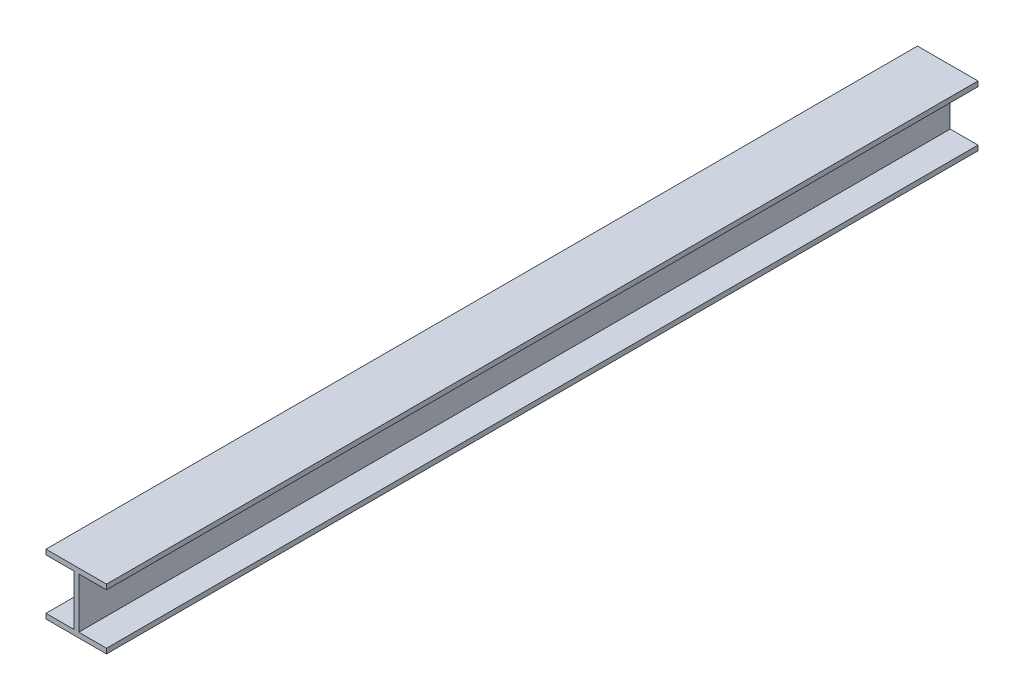
ISO-10303-21;
HEADER;
FILE_DESCRIPTION(('STEP AP214'),'2;1');
FILE_NAME('part.step','',(''),(''),'','','');
FILE_SCHEMA(('AUTOMOTIVE_DESIGN { 1 0 10303 214 1 1 1 1 }'));
ENDSEC;
DATA;
#1=APPLICATION_CONTEXT('core data for automotive mechanical design processes');
#2=APPLICATION_PROTOCOL_DEFINITION('international standard','automotive_design',2000,#1);
#3=PRODUCT_CONTEXT('',#1,'mechanical');
#4=PRODUCT('Part','Part','',(#3));
#5=PRODUCT_RELATED_PRODUCT_CATEGORY('part','',(#4));
#6=PRODUCT_DEFINITION_FORMATION('','',#4);
#7=PRODUCT_DEFINITION_CONTEXT('part definition',#1,'design');
#8=PRODUCT_DEFINITION('design','',#6,#7);
#9=PRODUCT_DEFINITION_SHAPE('','',#8);
#10=(LENGTH_UNIT() NAMED_UNIT(*) SI_UNIT(.MILLI.,.METRE.));
#11=(NAMED_UNIT(*) PLANE_ANGLE_UNIT() SI_UNIT($,.RADIAN.));
#12=(NAMED_UNIT(*) SI_UNIT($,.STERADIAN.) SOLID_ANGLE_UNIT());
#13=UNCERTAINTY_MEASURE_WITH_UNIT(LENGTH_MEASURE(1.E-05),#10,'distance_accuracy_value','');
#14=(GEOMETRIC_REPRESENTATION_CONTEXT(3) GLOBAL_UNCERTAINTY_ASSIGNED_CONTEXT((#13)) GLOBAL_UNIT_ASSIGNED_CONTEXT((#10,
#11,#12)) REPRESENTATION_CONTEXT('',''));
#15=CARTESIAN_POINT('',(0.,0.,0.));
#16=DIRECTION('',(0.,0.,1.));
#17=DIRECTION('',(1.,0.,0.));
#18=AXIS2_PLACEMENT_3D('',#15,#16,#17);
#19=CARTESIAN_POINT('',(63.5,63.5,914.4));
#20=DIRECTION('',(-1.,0.,0.));
#21=DIRECTION('',(0.,-1.,0.));
#22=AXIS2_PLACEMENT_3D('',#19,#20,#21);
#23=PLANE('',#22);
#24=DIRECTION('',(0.,1.,0.));
#25=VECTOR('',#24,1.);
#26=CARTESIAN_POINT('',(63.5,63.5,-914.4));
#27=LINE('',#26,#25);
#28=CARTESIAN_POINT('',(63.5,53.0352,-914.4));
#29=VERTEX_POINT('',#28);
#30=CARTESIAN_POINT('',(63.5,63.5,-914.4));
#31=VERTEX_POINT('',#30);
#32=EDGE_CURVE('E156',#29,#31,#27,.T.);
#33=ORIENTED_EDGE('',*,*,#32,.T.);
#34=DIRECTION('',(0.,0.,-1.));
#35=VECTOR('',#34,1.);
#36=CARTESIAN_POINT('',(63.5,63.5,914.4));
#37=LINE('',#36,#35);
#38=CARTESIAN_POINT('',(63.5,63.5,914.4));
#39=VERTEX_POINT('',#38);
#40=EDGE_CURVE('E11',#39,#31,#37,.T.);
#41=ORIENTED_EDGE('',*,*,#40,.F.);
#42=DIRECTION('',(0.,1.,0.));
#43=VECTOR('',#42,1.);
#44=CARTESIAN_POINT('',(63.5,63.5,914.4));
#45=LINE('',#44,#43);
#46=CARTESIAN_POINT('',(63.5,53.0352,914.4));
#47=VERTEX_POINT('',#46);
#48=EDGE_CURVE('E178',#47,#39,#45,.T.);
#49=ORIENTED_EDGE('',*,*,#48,.F.);
#50=DIRECTION('',(0.,0.,-1.));
#51=VECTOR('',#50,1.);
#52=CARTESIAN_POINT('',(63.5,53.0352,914.4));
#53=LINE('',#52,#51);
#54=EDGE_CURVE('E152',#47,#29,#53,.T.);
#55=ORIENTED_EDGE('',*,*,#54,.T.);
#56=EDGE_LOOP('',(#33,#41,#49,#55));
#57=FACE_BOUND('',#56,.T.);
#58=ADVANCED_FACE('F36',(#57),#23,.F.);
#59=CARTESIAN_POINT('',(-63.5,63.5,914.4));
#60=DIRECTION('',(0.,-1.,0.));
#61=DIRECTION('',(1.,0.,0.));
#62=AXIS2_PLACEMENT_3D('',#59,#60,#61);
#63=PLANE('',#62);
#64=DIRECTION('',(-1.,0.,0.));
#65=VECTOR('',#64,1.);
#66=CARTESIAN_POINT('',(-63.5,63.5,-914.4));
#67=LINE('',#66,#65);
#68=CARTESIAN_POINT('',(-63.5,63.5,-914.4));
#69=VERTEX_POINT('',#68);
#70=EDGE_CURVE('E159',#31,#69,#67,.T.);
#71=ORIENTED_EDGE('',*,*,#70,.T.);
#72=DIRECTION('',(0.,0.,-1.));
#73=VECTOR('',#72,1.);
#74=CARTESIAN_POINT('',(-63.5,63.5,914.4));
#75=LINE('',#74,#73);
#76=CARTESIAN_POINT('',(-63.5,63.5,914.4));
#77=VERTEX_POINT('',#76);
#78=EDGE_CURVE('E44',#77,#69,#75,.T.);
#79=ORIENTED_EDGE('',*,*,#78,.F.);
#80=DIRECTION('',(-1.,0.,0.));
#81=VECTOR('',#80,1.);
#82=CARTESIAN_POINT('',(-63.5,63.5,914.4));
#83=LINE('',#82,#81);
#84=EDGE_CURVE('E107',#39,#77,#83,.T.);
#85=ORIENTED_EDGE('',*,*,#84,.F.);
#86=ORIENTED_EDGE('',*,*,#40,.T.);
#87=EDGE_LOOP('',(#71,#79,#85,#86));
#88=FACE_BOUND('',#87,.T.);
#89=ADVANCED_FACE('F256',(#88),#63,.F.);
#90=CARTESIAN_POINT('',(-63.5,63.5,914.4));
#91=DIRECTION('',(1.,0.,0.));
#92=DIRECTION('',(0.,1.,0.));
#93=AXIS2_PLACEMENT_3D('',#90,#91,#92);
#94=PLANE('',#93);
#95=DIRECTION('',(0.,-1.,0.));
#96=VECTOR('',#95,1.);
#97=CARTESIAN_POINT('',(-63.5,63.5,-914.4));
#98=LINE('',#97,#96);
#99=CARTESIAN_POINT('',(-63.5,53.0352,-914.4));
#100=VERTEX_POINT('',#99);
#101=EDGE_CURVE('E161',#69,#100,#98,.T.);
#102=ORIENTED_EDGE('',*,*,#101,.T.);
#103=DIRECTION('',(0.,0.,-1.));
#104=VECTOR('',#103,1.);
#105=CARTESIAN_POINT('',(-63.5,53.0352,914.4));
#106=LINE('',#105,#104);
#107=CARTESIAN_POINT('',(-63.5,53.0352,914.4));
#108=VERTEX_POINT('',#107);
#109=EDGE_CURVE('E197',#108,#100,#106,.T.);
#110=ORIENTED_EDGE('',*,*,#109,.F.);
#111=DIRECTION('',(0.,-1.,0.));
#112=VECTOR('',#111,1.);
#113=CARTESIAN_POINT('',(-63.5,63.5,914.4));
#114=LINE('',#113,#112);
#115=EDGE_CURVE('E205',#77,#108,#114,.T.);
#116=ORIENTED_EDGE('',*,*,#115,.F.);
#117=ORIENTED_EDGE('',*,*,#78,.T.);
#118=EDGE_LOOP('',(#102,#110,#116,#117));
#119=FACE_BOUND('',#118,.T.);
#120=ADVANCED_FACE('F203',(#119),#94,.F.);
#121=CARTESIAN_POINT('',(-63.5,53.0352,914.4));
#122=DIRECTION('',(0.,1.,0.));
#123=DIRECTION('',(-1.,0.,0.));
#124=AXIS2_PLACEMENT_3D('',#121,#122,#123);
#125=PLANE('',#124);
#126=DIRECTION('',(1.,0.,0.));
#127=VECTOR('',#126,1.);
#128=CARTESIAN_POINT('',(-63.5,53.0352,-914.4));
#129=LINE('',#128,#127);
#130=CARTESIAN_POINT('',(-5.24510000000002,53.0352,-914.4));
#131=VERTEX_POINT('',#130);
#132=EDGE_CURVE('E163',#100,#131,#129,.T.);
#133=ORIENTED_EDGE('',*,*,#132,.T.);
#134=DIRECTION('',(0.,0.,-1.));
#135=VECTOR('',#134,1.);
#136=CARTESIAN_POINT('',(-5.24510000000002,53.0352,914.4));
#137=LINE('',#136,#135);
#138=CARTESIAN_POINT('',(-5.24510000000002,53.0352,914.4));
#139=VERTEX_POINT('',#138);
#140=EDGE_CURVE('E194',#139,#131,#137,.T.);
#141=ORIENTED_EDGE('',*,*,#140,.F.);
#142=DIRECTION('',(1.,0.,0.));
#143=VECTOR('',#142,1.);
#144=CARTESIAN_POINT('',(-63.5,53.0352,914.4));
#145=LINE('',#144,#143);
#146=EDGE_CURVE('E223',#108,#139,#145,.T.);
#147=ORIENTED_EDGE('',*,*,#146,.F.);
#148=ORIENTED_EDGE('',*,*,#109,.T.);
#149=EDGE_LOOP('',(#133,#141,#147,#148));
#150=FACE_BOUND('',#149,.T.);
#151=ADVANCED_FACE('F214',(#150),#125,.F.);
#152=CARTESIAN_POINT('',(-5.24510000000002,53.0352,914.4));
#153=DIRECTION('',(1.,0.,0.));
#154=DIRECTION('',(0.,1.,0.));
#155=AXIS2_PLACEMENT_3D('',#152,#153,#154);
#156=PLANE('',#155);
#157=DIRECTION('',(0.,-1.,0.));
#158=VECTOR('',#157,1.);
#159=CARTESIAN_POINT('',(-5.24510000000002,53.0352,-914.4));
#160=LINE('',#159,#158);
#161=CARTESIAN_POINT('',(-5.2451,-53.0352,-914.4));
#162=VERTEX_POINT('',#161);
#163=EDGE_CURVE('E165',#131,#162,#160,.T.);
#164=ORIENTED_EDGE('',*,*,#163,.T.);
#165=DIRECTION('',(0.,0.,-1.));
#166=VECTOR('',#165,1.);
#167=CARTESIAN_POINT('',(-5.2451,-53.0352,914.4));
#168=LINE('',#167,#166);
#169=CARTESIAN_POINT('',(-5.2451,-53.0352,914.4));
#170=VERTEX_POINT('',#169);
#171=EDGE_CURVE('E191',#170,#162,#168,.T.);
#172=ORIENTED_EDGE('',*,*,#171,.F.);
#173=DIRECTION('',(0.,-1.,0.));
#174=VECTOR('',#173,1.);
#175=CARTESIAN_POINT('',(-5.24510000000002,53.0352,914.4));
#176=LINE('',#175,#174);
#177=EDGE_CURVE('E220',#139,#170,#176,.T.);
#178=ORIENTED_EDGE('',*,*,#177,.F.);
#179=ORIENTED_EDGE('',*,*,#140,.T.);
#180=EDGE_LOOP('',(#164,#172,#178,#179));
#181=FACE_BOUND('',#180,.T.);
#182=ADVANCED_FACE('F218',(#181),#156,.F.);
#183=CARTESIAN_POINT('',(-5.2451,-53.0352,914.4));
#184=DIRECTION('',(0.,-1.,0.));
#185=DIRECTION('',(1.,0.,0.));
#186=AXIS2_PLACEMENT_3D('',#183,#184,#185);
#187=PLANE('',#186);
#188=DIRECTION('',(-1.,0.,0.));
#189=VECTOR('',#188,1.);
#190=CARTESIAN_POINT('',(-5.2451,-53.0352,-914.4));
#191=LINE('',#190,#189);
#192=CARTESIAN_POINT('',(-63.5,-53.0352000000001,-914.4));
#193=VERTEX_POINT('',#192);
#194=EDGE_CURVE('E167',#162,#193,#191,.T.);
#195=ORIENTED_EDGE('',*,*,#194,.T.);
#196=DIRECTION('',(0.,0.,-1.));
#197=VECTOR('',#196,1.);
#198=CARTESIAN_POINT('',(-63.5,-53.0352000000001,914.4));
#199=LINE('',#198,#197);
#200=CARTESIAN_POINT('',(-63.5,-53.0352000000001,914.4));
#201=VERTEX_POINT('',#200);
#202=EDGE_CURVE('E188',#201,#193,#199,.T.);
#203=ORIENTED_EDGE('',*,*,#202,.F.);
#204=DIRECTION('',(-1.,0.,0.));
#205=VECTOR('',#204,1.);
#206=CARTESIAN_POINT('',(-5.2451,-53.0352,914.4));
#207=LINE('',#206,#205);
#208=EDGE_CURVE('E222',#170,#201,#207,.T.);
#209=ORIENTED_EDGE('',*,*,#208,.F.);
#210=ORIENTED_EDGE('',*,*,#171,.T.);
#211=EDGE_LOOP('',(#195,#203,#209,#210));
#212=FACE_BOUND('',#211,.T.);
#213=ADVANCED_FACE('F269',(#212),#187,.F.);
#214=CARTESIAN_POINT('',(-63.5,-53.0352000000001,914.4));
#215=DIRECTION('',(1.,0.,0.));
#216=DIRECTION('',(0.,1.,0.));
#217=AXIS2_PLACEMENT_3D('',#214,#215,#216);
#218=PLANE('',#217);
#219=DIRECTION('',(0.,-1.,0.));
#220=VECTOR('',#219,1.);
#221=CARTESIAN_POINT('',(-63.5,-53.0352000000001,-914.4));
#222=LINE('',#221,#220);
#223=CARTESIAN_POINT('',(-63.5,-63.5,-914.4));
#224=VERTEX_POINT('',#223);
#225=EDGE_CURVE('E169',#193,#224,#222,.T.);
#226=ORIENTED_EDGE('',*,*,#225,.T.);
#227=DIRECTION('',(0.,0.,-1.));
#228=VECTOR('',#227,1.);
#229=CARTESIAN_POINT('',(-63.5,-63.5,914.4));
#230=LINE('',#229,#228);
#231=CARTESIAN_POINT('',(-63.5,-63.5,914.4));
#232=VERTEX_POINT('',#231);
#233=EDGE_CURVE('E185',#232,#224,#230,.T.);
#234=ORIENTED_EDGE('',*,*,#233,.F.);
#235=DIRECTION('',(0.,-1.,0.));
#236=VECTOR('',#235,1.);
#237=CARTESIAN_POINT('',(-63.5,-53.0352000000001,914.4));
#238=LINE('',#237,#236);
#239=EDGE_CURVE('E225',#201,#232,#238,.T.);
#240=ORIENTED_EDGE('',*,*,#239,.F.);
#241=ORIENTED_EDGE('',*,*,#202,.T.);
#242=EDGE_LOOP('',(#226,#234,#240,#241));
#243=FACE_BOUND('',#242,.T.);
#244=ADVANCED_FACE('F272',(#243),#218,.F.);
#245=CARTESIAN_POINT('',(63.5,-63.5,914.4));
#246=DIRECTION('',(0.,1.,0.));
#247=DIRECTION('',(-1.,0.,0.));
#248=AXIS2_PLACEMENT_3D('',#245,#246,#247);
#249=PLANE('',#248);
#250=DIRECTION('',(1.,0.,0.));
#251=VECTOR('',#250,1.);
#252=CARTESIAN_POINT('',(63.5,-63.5,-914.4));
#253=LINE('',#252,#251);
#254=CARTESIAN_POINT('',(63.5,-63.5,-914.4));
#255=VERTEX_POINT('',#254);
#256=EDGE_CURVE('E171',#224,#255,#253,.T.);
#257=ORIENTED_EDGE('',*,*,#256,.T.);
#258=DIRECTION('',(0.,0.,-1.));
#259=VECTOR('',#258,1.);
#260=CARTESIAN_POINT('',(63.5,-63.5,914.4));
#261=LINE('',#260,#259);
#262=CARTESIAN_POINT('',(63.5,-63.5,914.4));
#263=VERTEX_POINT('',#262);
#264=EDGE_CURVE('E182',#263,#255,#261,.T.);
#265=ORIENTED_EDGE('',*,*,#264,.F.);
#266=DIRECTION('',(1.,0.,0.));
#267=VECTOR('',#266,1.);
#268=CARTESIAN_POINT('',(63.5,-63.5,914.4));
#269=LINE('',#268,#267);
#270=EDGE_CURVE('E231',#232,#263,#269,.T.);
#271=ORIENTED_EDGE('',*,*,#270,.F.);
#272=ORIENTED_EDGE('',*,*,#233,.T.);
#273=EDGE_LOOP('',(#257,#265,#271,#272));
#274=FACE_BOUND('',#273,.T.);
#275=ADVANCED_FACE('F237',(#274),#249,.F.);
#276=CARTESIAN_POINT('',(63.5,-53.0352,914.4));
#277=DIRECTION('',(-1.,0.,0.));
#278=DIRECTION('',(0.,-1.,0.));
#279=AXIS2_PLACEMENT_3D('',#276,#277,#278);
#280=PLANE('',#279);
#281=DIRECTION('',(0.,1.,0.));
#282=VECTOR('',#281,1.);
#283=CARTESIAN_POINT('',(63.5,-53.0352,-914.4));
#284=LINE('',#283,#282);
#285=CARTESIAN_POINT('',(63.5,-53.0352,-914.4));
#286=VERTEX_POINT('',#285);
#287=EDGE_CURVE('E173',#255,#286,#284,.T.);
#288=ORIENTED_EDGE('',*,*,#287,.T.);
#289=DIRECTION('',(0.,0.,-1.));
#290=VECTOR('',#289,1.);
#291=CARTESIAN_POINT('',(63.5,-53.0352,914.4));
#292=LINE('',#291,#290);
#293=CARTESIAN_POINT('',(63.5,-53.0352,914.4));
#294=VERTEX_POINT('',#293);
#295=EDGE_CURVE('E147',#294,#286,#292,.T.);
#296=ORIENTED_EDGE('',*,*,#295,.F.);
#297=DIRECTION('',(0.,1.,0.));
#298=VECTOR('',#297,1.);
#299=CARTESIAN_POINT('',(63.5,-53.0352,914.4));
#300=LINE('',#299,#298);
#301=EDGE_CURVE('E138',#263,#294,#300,.T.);
#302=ORIENTED_EDGE('',*,*,#301,.F.);
#303=ORIENTED_EDGE('',*,*,#264,.T.);
#304=EDGE_LOOP('',(#288,#296,#302,#303));
#305=FACE_BOUND('',#304,.T.);
#306=ADVANCED_FACE('F241',(#305),#280,.F.);
#307=CARTESIAN_POINT('',(5.24510000000001,-53.0352,914.4));
#308=DIRECTION('',(0.,-1.,0.));
#309=DIRECTION('',(1.,0.,0.));
#310=AXIS2_PLACEMENT_3D('',#307,#308,#309);
#311=PLANE('',#310);
#312=DIRECTION('',(-1.,0.,0.));
#313=VECTOR('',#312,1.);
#314=CARTESIAN_POINT('',(5.24510000000001,-53.0352,-914.4));
#315=LINE('',#314,#313);
#316=CARTESIAN_POINT('',(5.24510000000001,-53.0352,-914.4));
#317=VERTEX_POINT('',#316);
#318=EDGE_CURVE('E146',#286,#317,#315,.T.);
#319=ORIENTED_EDGE('',*,*,#318,.T.);
#320=DIRECTION('',(0.,0.,-1.));
#321=VECTOR('',#320,1.);
#322=CARTESIAN_POINT('',(5.24510000000001,-53.0352,914.4));
#323=LINE('',#322,#321);
#324=CARTESIAN_POINT('',(5.24510000000001,-53.0352,914.4));
#325=VERTEX_POINT('',#324);
#326=EDGE_CURVE('E143',#325,#317,#323,.T.);
#327=ORIENTED_EDGE('',*,*,#326,.F.);
#328=DIRECTION('',(-1.,0.,0.));
#329=VECTOR('',#328,1.);
#330=CARTESIAN_POINT('',(5.24510000000001,-53.0352,914.4));
#331=LINE('',#330,#329);
#332=EDGE_CURVE('E132',#294,#325,#331,.T.);
#333=ORIENTED_EDGE('',*,*,#332,.F.);
#334=ORIENTED_EDGE('',*,*,#295,.T.);
#335=EDGE_LOOP('',(#319,#327,#333,#334));
#336=FACE_BOUND('',#335,.T.);
#337=ADVANCED_FACE('F144',(#336),#311,.F.);
#338=CARTESIAN_POINT('',(5.24510000000001,53.0352,914.4));
#339=DIRECTION('',(-1.,0.,0.));
#340=DIRECTION('',(0.,0.,1.));
#341=AXIS2_PLACEMENT_3D('',#338,#339,#340);
#342=PLANE('',#341);
#343=DIRECTION('',(0.,1.,0.));
#344=VECTOR('',#343,1.);
#345=CARTESIAN_POINT('',(5.24510000000001,53.0352,-914.4));
#346=LINE('',#345,#344);
#347=CARTESIAN_POINT('',(5.24510000000001,53.0352,-914.4));
#348=VERTEX_POINT('',#347);
#349=EDGE_CURVE('E93',#317,#348,#346,.T.);
#350=ORIENTED_EDGE('',*,*,#349,.T.);
#351=DIRECTION('',(0.,0.,-1.));
#352=VECTOR('',#351,1.);
#353=CARTESIAN_POINT('',(5.24510000000001,53.0352,914.4));
#354=LINE('',#353,#352);
#355=CARTESIAN_POINT('',(5.24510000000001,53.0352,914.4));
#356=VERTEX_POINT('',#355);
#357=EDGE_CURVE('E148',#356,#348,#354,.T.);
#358=ORIENTED_EDGE('',*,*,#357,.F.);
#359=DIRECTION('',(0.,1.,0.));
#360=VECTOR('',#359,1.);
#361=CARTESIAN_POINT('',(5.24510000000001,53.0352,914.4));
#362=LINE('',#361,#360);
#363=EDGE_CURVE('E136',#325,#356,#362,.T.);
#364=ORIENTED_EDGE('',*,*,#363,.F.);
#365=ORIENTED_EDGE('',*,*,#326,.T.);
#366=EDGE_LOOP('',(#350,#358,#364,#365));
#367=FACE_BOUND('',#366,.T.);
#368=ADVANCED_FACE('F150',(#367),#342,.F.);
#369=CARTESIAN_POINT('',(63.5,53.0352,914.4));
#370=DIRECTION('',(0.,1.,0.));
#371=DIRECTION('',(-1.,0.,0.));
#372=AXIS2_PLACEMENT_3D('',#369,#370,#371);
#373=PLANE('',#372);
#374=DIRECTION('',(1.,0.,0.));
#375=VECTOR('',#374,1.);
#376=CARTESIAN_POINT('',(63.5,53.0352,-914.4));
#377=LINE('',#376,#375);
#378=EDGE_CURVE('E99',#348,#29,#377,.T.);
#379=ORIENTED_EDGE('',*,*,#378,.T.);
#380=ORIENTED_EDGE('',*,*,#54,.F.);
#381=DIRECTION('',(1.,0.,0.));
#382=VECTOR('',#381,1.);
#383=CARTESIAN_POINT('',(63.5,53.0352,914.4));
#384=LINE('',#383,#382);
#385=EDGE_CURVE('E52',#356,#47,#384,.T.);
#386=ORIENTED_EDGE('',*,*,#385,.F.);
#387=ORIENTED_EDGE('',*,*,#357,.T.);
#388=EDGE_LOOP('',(#379,#380,#386,#387));
#389=FACE_BOUND('',#388,.T.);
#390=ADVANCED_FACE('F245',(#389),#373,.F.);
#391=CARTESIAN_POINT('',(0.,0.,914.4));
#392=DIRECTION('',(0.,0.,-1.));
#393=DIRECTION('',(-1.,0.,0.));
#394=AXIS2_PLACEMENT_3D('',#391,#392,#393);
#395=PLANE('',#394);
#396=ORIENTED_EDGE('',*,*,#48,.T.);
#397=ORIENTED_EDGE('',*,*,#84,.T.);
#398=ORIENTED_EDGE('',*,*,#115,.T.);
#399=ORIENTED_EDGE('',*,*,#146,.T.);
#400=ORIENTED_EDGE('',*,*,#177,.T.);
#401=ORIENTED_EDGE('',*,*,#208,.T.);
#402=ORIENTED_EDGE('',*,*,#239,.T.);
#403=ORIENTED_EDGE('',*,*,#270,.T.);
#404=ORIENTED_EDGE('',*,*,#301,.T.);
#405=ORIENTED_EDGE('',*,*,#332,.T.);
#406=ORIENTED_EDGE('',*,*,#363,.T.);
#407=ORIENTED_EDGE('',*,*,#385,.T.);
#408=EDGE_LOOP('',(#396,#397,#398,#399,#400,#401,#402,#403,#404,#405,#406,#407));
#409=FACE_BOUND('',#408,.T.);
#410=ADVANCED_FACE('F134',(#409),#395,.F.);
#411=CARTESIAN_POINT('',(0.,0.,-914.4));
#412=DIRECTION('',(0.,0.,-1.));
#413=DIRECTION('',(-1.,0.,0.));
#414=AXIS2_PLACEMENT_3D('',#411,#412,#413);
#415=PLANE('',#414);
#416=ORIENTED_EDGE('',*,*,#32,.F.);
#417=ORIENTED_EDGE('',*,*,#378,.F.);
#418=ORIENTED_EDGE('',*,*,#349,.F.);
#419=ORIENTED_EDGE('',*,*,#318,.F.);
#420=ORIENTED_EDGE('',*,*,#287,.F.);
#421=ORIENTED_EDGE('',*,*,#256,.F.);
#422=ORIENTED_EDGE('',*,*,#225,.F.);
#423=ORIENTED_EDGE('',*,*,#194,.F.);
#424=ORIENTED_EDGE('',*,*,#163,.F.);
#425=ORIENTED_EDGE('',*,*,#132,.F.);
#426=ORIENTED_EDGE('',*,*,#101,.F.);
#427=ORIENTED_EDGE('',*,*,#70,.F.);
#428=EDGE_LOOP('',(#416,#417,#418,#419,#420,#421,#422,#423,#424,#425,#426,#427));
#429=FACE_BOUND('',#428,.T.);
#430=ADVANCED_FACE('F209',(#429),#415,.T.);
#431=CLOSED_SHELL('',(#58,#89,#120,#151,#182,#213,#244,#275,#306,#337,#368,#390,#410,#430));
#432=MANIFOLD_SOLID_BREP('B2',#431);
#433=ADVANCED_BREP_SHAPE_REPRESENTATION('',(#18,#432),#14);
#434=SHAPE_DEFINITION_REPRESENTATION(#9,#433);
ENDSEC;
END-ISO-10303-21;
